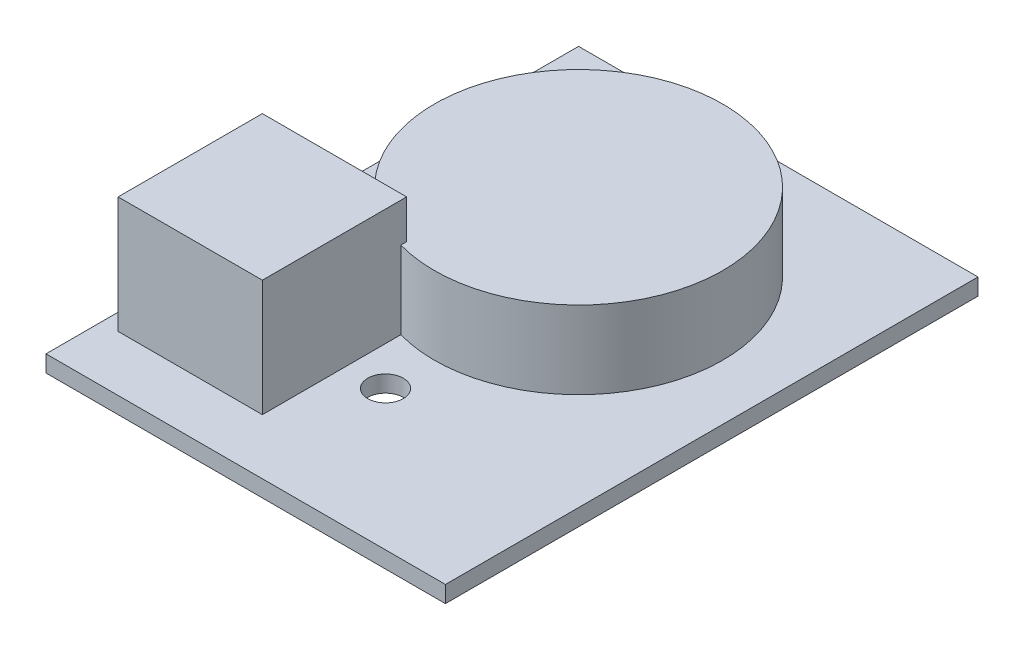
ISO-10303-21;
HEADER;
FILE_DESCRIPTION(('STEP AP214'),'2;1');
FILE_NAME('part.step','',(''),(''),'','','');
FILE_SCHEMA(('AUTOMOTIVE_DESIGN { 1 0 10303 214 1 1 1 1 }'));
ENDSEC;
DATA;
#1=APPLICATION_CONTEXT('core data for automotive mechanical design processes');
#2=APPLICATION_PROTOCOL_DEFINITION('international standard','automotive_design',2000,#1);
#3=PRODUCT_CONTEXT('',#1,'mechanical');
#4=PRODUCT('Part','Part','',(#3));
#5=PRODUCT_RELATED_PRODUCT_CATEGORY('part','',(#4));
#6=PRODUCT_DEFINITION_FORMATION('','',#4);
#7=PRODUCT_DEFINITION_CONTEXT('part definition',#1,'design');
#8=PRODUCT_DEFINITION('design','',#6,#7);
#9=PRODUCT_DEFINITION_SHAPE('','',#8);
#10=(LENGTH_UNIT() NAMED_UNIT(*) SI_UNIT(.MILLI.,.METRE.));
#11=(NAMED_UNIT(*) PLANE_ANGLE_UNIT() SI_UNIT($,.RADIAN.));
#12=(NAMED_UNIT(*) SI_UNIT($,.STERADIAN.) SOLID_ANGLE_UNIT());
#13=UNCERTAINTY_MEASURE_WITH_UNIT(LENGTH_MEASURE(1.E-05),#10,'distance_accuracy_value','');
#14=(GEOMETRIC_REPRESENTATION_CONTEXT(3) GLOBAL_UNCERTAINTY_ASSIGNED_CONTEXT((#13)) GLOBAL_UNIT_ASSIGNED_CONTEXT((#10,
#11,#12)) REPRESENTATION_CONTEXT('',''));
#15=CARTESIAN_POINT('',(0.,0.,0.));
#16=DIRECTION('',(0.,0.,1.));
#17=DIRECTION('',(1.,0.,0.));
#18=AXIS2_PLACEMENT_3D('',#15,#16,#17);
#19=CARTESIAN_POINT('',(-18.,1.5,24.));
#20=DIRECTION('',(-1.,0.,0.));
#21=DIRECTION('',(0.,0.,1.));
#22=AXIS2_PLACEMENT_3D('',#19,#20,#21);
#23=PLANE('',#22);
#24=DIRECTION('',(0.,0.,-1.));
#25=VECTOR('',#24,1.);
#26=CARTESIAN_POINT('',(-18.,0.,24.));
#27=LINE('',#26,#25);
#28=CARTESIAN_POINT('',(-18.,0.,24.));
#29=VERTEX_POINT('',#28);
#30=CARTESIAN_POINT('',(-18.,0.,-24.));
#31=VERTEX_POINT('',#30);
#32=EDGE_CURVE('E159',#29,#31,#27,.T.);
#33=ORIENTED_EDGE('',*,*,#32,.F.);
#34=DIRECTION('',(0.,-1.,0.));
#35=VECTOR('',#34,1.);
#36=CARTESIAN_POINT('',(-18.,1.5,24.));
#37=LINE('',#36,#35);
#38=CARTESIAN_POINT('',(-18.,1.5,24.));
#39=VERTEX_POINT('',#38);
#40=EDGE_CURVE('E163',#39,#29,#37,.T.);
#41=ORIENTED_EDGE('',*,*,#40,.F.);
#42=DIRECTION('',(0.,0.,-1.));
#43=VECTOR('',#42,1.);
#44=CARTESIAN_POINT('',(-18.,1.5,24.));
#45=LINE('',#44,#43);
#46=CARTESIAN_POINT('',(-18.,1.5,-24.));
#47=VERTEX_POINT('',#46);
#48=EDGE_CURVE('E164',#39,#47,#45,.T.);
#49=ORIENTED_EDGE('',*,*,#48,.T.);
#50=DIRECTION('',(0.,-1.,0.));
#51=VECTOR('',#50,1.);
#52=CARTESIAN_POINT('',(-18.,1.5,-24.));
#53=LINE('',#52,#51);
#54=EDGE_CURVE('E175',#47,#31,#53,.T.);
#55=ORIENTED_EDGE('',*,*,#54,.T.);
#56=EDGE_LOOP('',(#33,#41,#49,#55));
#57=FACE_BOUND('',#56,.T.);
#58=ADVANCED_FACE('F33',(#57),#23,.T.);
#59=CARTESIAN_POINT('',(-18.,1.5,24.));
#60=DIRECTION('',(0.,0.,-1.));
#61=DIRECTION('',(-1.,0.,0.));
#62=AXIS2_PLACEMENT_3D('',#59,#60,#61);
#63=PLANE('',#62);
#64=DIRECTION('',(1.,0.,0.));
#65=VECTOR('',#64,1.);
#66=CARTESIAN_POINT('',(-18.,0.,24.));
#67=LINE('',#66,#65);
#68=CARTESIAN_POINT('',(18.,0.,24.));
#69=VERTEX_POINT('',#68);
#70=EDGE_CURVE('E168',#29,#69,#67,.T.);
#71=ORIENTED_EDGE('',*,*,#70,.T.);
#72=DIRECTION('',(0.,-1.,0.));
#73=VECTOR('',#72,1.);
#74=CARTESIAN_POINT('',(18.,1.5,24.));
#75=LINE('',#74,#73);
#76=CARTESIAN_POINT('',(18.,1.5,24.));
#77=VERTEX_POINT('',#76);
#78=EDGE_CURVE('E186',#77,#69,#75,.T.);
#79=ORIENTED_EDGE('',*,*,#78,.F.);
#80=DIRECTION('',(1.,0.,0.));
#81=VECTOR('',#80,1.);
#82=CARTESIAN_POINT('',(-18.,1.5,24.));
#83=LINE('',#82,#81);
#84=EDGE_CURVE('E173',#39,#77,#83,.T.);
#85=ORIENTED_EDGE('',*,*,#84,.F.);
#86=ORIENTED_EDGE('',*,*,#40,.T.);
#87=EDGE_LOOP('',(#71,#79,#85,#86));
#88=FACE_BOUND('',#87,.T.);
#89=ADVANCED_FACE('F205',(#88),#63,.F.);
#90=CARTESIAN_POINT('',(18.,1.5,24.));
#91=DIRECTION('',(-1.,0.,0.));
#92=DIRECTION('',(0.,0.,1.));
#93=AXIS2_PLACEMENT_3D('',#90,#91,#92);
#94=PLANE('',#93);
#95=DIRECTION('',(0.,0.,-1.));
#96=VECTOR('',#95,1.);
#97=CARTESIAN_POINT('',(18.,0.,24.));
#98=LINE('',#97,#96);
#99=CARTESIAN_POINT('',(18.,0.,-24.));
#100=VERTEX_POINT('',#99);
#101=EDGE_CURVE('E181',#69,#100,#98,.T.);
#102=ORIENTED_EDGE('',*,*,#101,.T.);
#103=DIRECTION('',(0.,-1.,0.));
#104=VECTOR('',#103,1.);
#105=CARTESIAN_POINT('',(18.,1.5,-24.));
#106=LINE('',#105,#104);
#107=CARTESIAN_POINT('',(18.,1.5,-24.));
#108=VERTEX_POINT('',#107);
#109=EDGE_CURVE('E189',#108,#100,#106,.T.);
#110=ORIENTED_EDGE('',*,*,#109,.F.);
#111=DIRECTION('',(0.,0.,-1.));
#112=VECTOR('',#111,1.);
#113=CARTESIAN_POINT('',(18.,1.5,24.));
#114=LINE('',#113,#112);
#115=EDGE_CURVE('E171',#77,#108,#114,.T.);
#116=ORIENTED_EDGE('',*,*,#115,.F.);
#117=ORIENTED_EDGE('',*,*,#78,.T.);
#118=EDGE_LOOP('',(#102,#110,#116,#117));
#119=FACE_BOUND('',#118,.T.);
#120=ADVANCED_FACE('F209',(#119),#94,.F.);
#121=CARTESIAN_POINT('',(-18.,1.5,-24.));
#122=DIRECTION('',(0.,0.,-1.));
#123=DIRECTION('',(-1.,0.,0.));
#124=AXIS2_PLACEMENT_3D('',#121,#122,#123);
#125=PLANE('',#124);
#126=DIRECTION('',(1.,0.,0.));
#127=VECTOR('',#126,1.);
#128=CARTESIAN_POINT('',(-18.,0.,-24.));
#129=LINE('',#128,#127);
#130=EDGE_CURVE('E178',#31,#100,#129,.T.);
#131=ORIENTED_EDGE('',*,*,#130,.F.);
#132=ORIENTED_EDGE('',*,*,#54,.F.);
#133=DIRECTION('',(1.,0.,0.));
#134=VECTOR('',#133,1.);
#135=CARTESIAN_POINT('',(-18.,1.5,-24.));
#136=LINE('',#135,#134);
#137=EDGE_CURVE('E167',#47,#108,#136,.T.);
#138=ORIENTED_EDGE('',*,*,#137,.T.);
#139=ORIENTED_EDGE('',*,*,#109,.T.);
#140=EDGE_LOOP('',(#131,#132,#138,#139));
#141=FACE_BOUND('',#140,.T.);
#142=ADVANCED_FACE('F197',(#141),#125,.T.);
#143=CARTESIAN_POINT('',(0.,1.5,0.));
#144=DIRECTION('',(0.,-1.,0.));
#145=DIRECTION('',(0.,0.,-1.));
#146=AXIS2_PLACEMENT_3D('',#143,#144,#145);
#147=PLANE('',#146);
#148=CARTESIAN_POINT('',(0.,1.5,11.4));
#149=DIRECTION('',(0.,-1.,0.));
#150=DIRECTION('',(0.,0.,-1.));
#151=AXIS2_PLACEMENT_3D('',#148,#149,#150);
#152=CIRCLE('',#151,1.6);
#153=CARTESIAN_POINT('',(0.,1.5,9.8));
#154=VERTEX_POINT('',#153);
#155=EDGE_CURVE('E132',#154,#154,#152,.F.);
#156=ORIENTED_EDGE('',*,*,#155,.F.);
#157=EDGE_LOOP('',(#156));
#158=FACE_BOUND('',#157,.T.);
#159=DIRECTION('',(0.,0.,1.));
#160=VECTOR('',#159,1.);
#161=CARTESIAN_POINT('',(-16.5,1.5,0.));
#162=LINE('',#161,#160);
#163=CARTESIAN_POINT('',(-16.5,1.5,6.));
#164=VERTEX_POINT('',#163);
#165=CARTESIAN_POINT('',(-16.5,1.5,19.));
#166=VERTEX_POINT('',#165);
#167=EDGE_CURVE('E47',#164,#166,#162,.T.);
#168=ORIENTED_EDGE('',*,*,#167,.F.);
#169=DIRECTION('',(1.,0.,0.));
#170=VECTOR('',#169,1.);
#171=CARTESIAN_POINT('',(0.,1.5,6.));
#172=LINE('',#171,#170);
#173=CARTESIAN_POINT('',(-5.,1.5,6.));
#174=VERTEX_POINT('',#173);
#175=EDGE_CURVE('E152',#164,#174,#172,.T.);
#176=ORIENTED_EDGE('',*,*,#175,.T.);
#177=CARTESIAN_POINT('',(0.,1.5,-6.));
#178=DIRECTION('',(0.,-1.,0.));
#179=DIRECTION('',(0.,0.,-1.));
#180=AXIS2_PLACEMENT_3D('',#177,#178,#179);
#181=CIRCLE('',#180,13.);
#182=CARTESIAN_POINT('',(-3.5,1.5,6.51998402554891));
#183=VERTEX_POINT('',#182);
#184=EDGE_CURVE('E160',#183,#174,#181,.F.);
#185=ORIENTED_EDGE('',*,*,#184,.F.);
#186=DIRECTION('',(0.,0.,1.));
#187=VECTOR('',#186,1.);
#188=CARTESIAN_POINT('',(-3.5,1.5,0.));
#189=LINE('',#188,#187);
#190=CARTESIAN_POINT('',(-3.5,1.5,19.));
#191=VERTEX_POINT('',#190);
#192=EDGE_CURVE('E148',#183,#191,#189,.T.);
#193=ORIENTED_EDGE('',*,*,#192,.T.);
#194=DIRECTION('',(1.,0.,0.));
#195=VECTOR('',#194,1.);
#196=CARTESIAN_POINT('',(0.,1.5,19.));
#197=LINE('',#196,#195);
#198=EDGE_CURVE('E52',#166,#191,#197,.T.);
#199=ORIENTED_EDGE('',*,*,#198,.F.);
#200=EDGE_LOOP('',(#168,#176,#185,#193,#199));
#201=FACE_BOUND('',#200,.T.);
#202=ORIENTED_EDGE('',*,*,#48,.F.);
#203=ORIENTED_EDGE('',*,*,#84,.T.);
#204=ORIENTED_EDGE('',*,*,#115,.T.);
#205=ORIENTED_EDGE('',*,*,#137,.F.);
#206=EDGE_LOOP('',(#202,#203,#204,#205));
#207=FACE_BOUND('',#206,.T.);
#208=ADVANCED_FACE('F211',(#158,#201,#207),#147,.F.);
#209=CARTESIAN_POINT('',(0.,0.,0.));
#210=DIRECTION('',(0.,-1.,0.));
#211=DIRECTION('',(0.,0.,-1.));
#212=AXIS2_PLACEMENT_3D('',#209,#210,#211);
#213=PLANE('',#212);
#214=CARTESIAN_POINT('',(0.,0.,11.4));
#215=DIRECTION('',(0.,1.,0.));
#216=DIRECTION('',(0.,0.,1.));
#217=AXIS2_PLACEMENT_3D('',#214,#215,#216);
#218=CIRCLE('',#217,1.6);
#219=CARTESIAN_POINT('',(0.,0.,13.));
#220=VERTEX_POINT('',#219);
#221=EDGE_CURVE('E135',#220,#220,#218,.T.);
#222=ORIENTED_EDGE('',*,*,#221,.T.);
#223=EDGE_LOOP('',(#222));
#224=FACE_BOUND('',#223,.T.);
#225=ORIENTED_EDGE('',*,*,#32,.T.);
#226=ORIENTED_EDGE('',*,*,#130,.T.);
#227=ORIENTED_EDGE('',*,*,#101,.F.);
#228=ORIENTED_EDGE('',*,*,#70,.F.);
#229=EDGE_LOOP('',(#225,#226,#227,#228));
#230=FACE_BOUND('',#229,.T.);
#231=ADVANCED_FACE('F202',(#224,#230),#213,.T.);
#232=CARTESIAN_POINT('',(0.,8.5,-6.));
#233=DIRECTION('',(0.,-1.,0.));
#234=DIRECTION('',(0.,0.,-1.));
#235=AXIS2_PLACEMENT_3D('',#232,#233,#234);
#236=CYLINDRICAL_SURFACE('',#235,13.);
#237=ORIENTED_EDGE('',*,*,#184,.T.);
#238=DIRECTION('',(0.,-1.,0.));
#239=VECTOR('',#238,1.);
#240=CARTESIAN_POINT('',(-5.,8.5,6.));
#241=LINE('',#240,#239);
#242=CARTESIAN_POINT('',(-5.,8.5,6.));
#243=VERTEX_POINT('',#242);
#244=EDGE_CURVE('E150',#174,#243,#241,.F.);
#245=ORIENTED_EDGE('',*,*,#244,.T.);
#246=CARTESIAN_POINT('',(0.,8.5,-6.));
#247=DIRECTION('',(0.,1.,0.));
#248=DIRECTION('',(0.,0.,1.));
#249=AXIS2_PLACEMENT_3D('',#246,#247,#248);
#250=CIRCLE('',#249,13.);
#251=CARTESIAN_POINT('',(-3.5,8.5,6.51998402554891));
#252=VERTEX_POINT('',#251);
#253=EDGE_CURVE('E156',#252,#243,#250,.T.);
#254=ORIENTED_EDGE('',*,*,#253,.F.);
#255=DIRECTION('',(0.,-1.,0.));
#256=VECTOR('',#255,1.);
#257=CARTESIAN_POINT('',(-3.5,8.5,6.51998402554891));
#258=LINE('',#257,#256);
#259=EDGE_CURVE('E142',#252,#183,#258,.T.);
#260=ORIENTED_EDGE('',*,*,#259,.T.);
#261=EDGE_LOOP('',(#237,#245,#254,#260));
#262=FACE_BOUND('',#261,.T.);
#263=ADVANCED_FACE('F219',(#262),#236,.T.);
#264=CARTESIAN_POINT('',(0.,8.5,-6.));
#265=DIRECTION('',(0.,1.,0.));
#266=DIRECTION('',(0.,0.,1.));
#267=AXIS2_PLACEMENT_3D('',#264,#265,#266);
#268=PLANE('',#267);
#269=DIRECTION('',(-1.,0.,0.));
#270=VECTOR('',#269,1.);
#271=CARTESIAN_POINT('',(0.,8.5,6.));
#272=LINE('',#271,#270);
#273=CARTESIAN_POINT('',(-3.5,8.5,6.));
#274=VERTEX_POINT('',#273);
#275=EDGE_CURVE('E11',#274,#243,#272,.T.);
#276=ORIENTED_EDGE('',*,*,#275,.F.);
#277=DIRECTION('',(0.,0.,-1.));
#278=VECTOR('',#277,1.);
#279=CARTESIAN_POINT('',(-3.5,8.5,-6.));
#280=LINE('',#279,#278);
#281=EDGE_CURVE('E40',#252,#274,#280,.T.);
#282=ORIENTED_EDGE('',*,*,#281,.F.);
#283=ORIENTED_EDGE('',*,*,#253,.T.);
#284=EDGE_LOOP('',(#276,#282,#283));
#285=FACE_BOUND('',#284,.T.);
#286=ADVANCED_FACE('F249',(#285),#268,.T.);
#287=CARTESIAN_POINT('',(-16.5,12.,6.));
#288=DIRECTION('',(1.,0.,0.));
#289=DIRECTION('',(0.,0.,-1.));
#290=AXIS2_PLACEMENT_3D('',#287,#288,#289);
#291=PLANE('',#290);
#292=DIRECTION('',(0.,-1.,0.));
#293=VECTOR('',#292,1.);
#294=CARTESIAN_POINT('',(-16.5,12.,6.));
#295=LINE('',#294,#293);
#296=CARTESIAN_POINT('',(-16.5,12.,6.));
#297=VERTEX_POINT('',#296);
#298=EDGE_CURVE('E130',#297,#164,#295,.T.);
#299=ORIENTED_EDGE('',*,*,#298,.T.);
#300=ORIENTED_EDGE('',*,*,#167,.T.);
#301=DIRECTION('',(0.,-1.,0.));
#302=VECTOR('',#301,1.);
#303=CARTESIAN_POINT('',(-16.5,12.,19.));
#304=LINE('',#303,#302);
#305=CARTESIAN_POINT('',(-16.5,12.,19.));
#306=VERTEX_POINT('',#305);
#307=EDGE_CURVE('E143',#306,#166,#304,.T.);
#308=ORIENTED_EDGE('',*,*,#307,.F.);
#309=DIRECTION('',(0.,0.,1.));
#310=VECTOR('',#309,1.);
#311=CARTESIAN_POINT('',(-16.5,12.,6.));
#312=LINE('',#311,#310);
#313=EDGE_CURVE('E118',#297,#306,#312,.T.);
#314=ORIENTED_EDGE('',*,*,#313,.F.);
#315=EDGE_LOOP('',(#299,#300,#308,#314));
#316=FACE_BOUND('',#315,.T.);
#317=ADVANCED_FACE('F259',(#316),#291,.F.);
#318=CARTESIAN_POINT('',(-16.5,12.,19.));
#319=DIRECTION('',(0.,0.,-1.));
#320=DIRECTION('',(-1.,0.,0.));
#321=AXIS2_PLACEMENT_3D('',#318,#319,#320);
#322=PLANE('',#321);
#323=ORIENTED_EDGE('',*,*,#307,.T.);
#324=ORIENTED_EDGE('',*,*,#198,.T.);
#325=DIRECTION('',(0.,-1.,0.));
#326=VECTOR('',#325,1.);
#327=CARTESIAN_POINT('',(-3.5,12.,19.));
#328=LINE('',#327,#326);
#329=CARTESIAN_POINT('',(-3.5,12.,19.));
#330=VERTEX_POINT('',#329);
#331=EDGE_CURVE('E117',#330,#191,#328,.T.);
#332=ORIENTED_EDGE('',*,*,#331,.F.);
#333=DIRECTION('',(1.,0.,0.));
#334=VECTOR('',#333,1.);
#335=CARTESIAN_POINT('',(-16.5,12.,19.));
#336=LINE('',#335,#334);
#337=EDGE_CURVE('E125',#306,#330,#336,.T.);
#338=ORIENTED_EDGE('',*,*,#337,.F.);
#339=EDGE_LOOP('',(#323,#324,#332,#338));
#340=FACE_BOUND('',#339,.T.);
#341=ADVANCED_FACE('F269',(#340),#322,.F.);
#342=CARTESIAN_POINT('',(-16.5,12.,6.));
#343=DIRECTION('',(0.,0.,-1.));
#344=DIRECTION('',(-1.,0.,0.));
#345=AXIS2_PLACEMENT_3D('',#342,#343,#344);
#346=PLANE('',#345);
#347=ORIENTED_EDGE('',*,*,#175,.F.);
#348=ORIENTED_EDGE('',*,*,#298,.F.);
#349=DIRECTION('',(1.,0.,0.));
#350=VECTOR('',#349,1.);
#351=CARTESIAN_POINT('',(-16.5,12.,6.));
#352=LINE('',#351,#350);
#353=CARTESIAN_POINT('',(-3.5,12.,6.));
#354=VERTEX_POINT('',#353);
#355=EDGE_CURVE('E123',#297,#354,#352,.T.);
#356=ORIENTED_EDGE('',*,*,#355,.T.);
#357=DIRECTION('',(0.,-1.,0.));
#358=VECTOR('',#357,1.);
#359=CARTESIAN_POINT('',(-3.5,12.,6.));
#360=LINE('',#359,#358);
#361=EDGE_CURVE('E108',#354,#274,#360,.T.);
#362=ORIENTED_EDGE('',*,*,#361,.T.);
#363=ORIENTED_EDGE('',*,*,#275,.T.);
#364=ORIENTED_EDGE('',*,*,#244,.F.);
#365=EDGE_LOOP('',(#347,#348,#356,#362,#363,#364));
#366=FACE_BOUND('',#365,.T.);
#367=ADVANCED_FACE('F128',(#366),#346,.T.);
#368=CARTESIAN_POINT('',(-3.5,12.,6.));
#369=DIRECTION('',(1.,0.,0.));
#370=DIRECTION('',(0.,0.,-1.));
#371=AXIS2_PLACEMENT_3D('',#368,#369,#370);
#372=PLANE('',#371);
#373=ORIENTED_EDGE('',*,*,#192,.F.);
#374=ORIENTED_EDGE('',*,*,#259,.F.);
#375=ORIENTED_EDGE('',*,*,#281,.T.);
#376=ORIENTED_EDGE('',*,*,#361,.F.);
#377=DIRECTION('',(0.,0.,1.));
#378=VECTOR('',#377,1.);
#379=CARTESIAN_POINT('',(-3.5,12.,6.));
#380=LINE('',#379,#378);
#381=EDGE_CURVE('E113',#354,#330,#380,.T.);
#382=ORIENTED_EDGE('',*,*,#381,.T.);
#383=ORIENTED_EDGE('',*,*,#331,.T.);
#384=EDGE_LOOP('',(#373,#374,#375,#376,#382,#383));
#385=FACE_BOUND('',#384,.T.);
#386=ADVANCED_FACE('F111',(#385),#372,.T.);
#387=CARTESIAN_POINT('',(0.,12.,0.));
#388=DIRECTION('',(0.,-1.,0.));
#389=DIRECTION('',(0.,0.,-1.));
#390=AXIS2_PLACEMENT_3D('',#387,#388,#389);
#391=PLANE('',#390);
#392=ORIENTED_EDGE('',*,*,#355,.F.);
#393=ORIENTED_EDGE('',*,*,#313,.T.);
#394=ORIENTED_EDGE('',*,*,#337,.T.);
#395=ORIENTED_EDGE('',*,*,#381,.F.);
#396=EDGE_LOOP('',(#392,#393,#394,#395));
#397=FACE_BOUND('',#396,.T.);
#398=ADVANCED_FACE('F122',(#397),#391,.F.);
#399=CARTESIAN_POINT('',(0.,12.,11.4));
#400=DIRECTION('',(0.,-1.,0.));
#401=DIRECTION('',(0.,0.,-1.));
#402=AXIS2_PLACEMENT_3D('',#399,#400,#401);
#403=CYLINDRICAL_SURFACE('',#402,1.6);
#404=ORIENTED_EDGE('',*,*,#221,.F.);
#405=EDGE_LOOP('',(#404));
#406=FACE_BOUND('',#405,.T.);
#407=ORIENTED_EDGE('',*,*,#155,.T.);
#408=EDGE_LOOP('',(#407));
#409=FACE_BOUND('',#408,.T.);
#410=ADVANCED_FACE('F303',(#406,#409),#403,.F.);
#411=CLOSED_SHELL('',(#58,#89,#120,#142,#208,#231,#263,#286,#317,#341,#367,#386,#398,#410));
#412=MANIFOLD_SOLID_BREP('B2',#411);
#413=ADVANCED_BREP_SHAPE_REPRESENTATION('',(#18,#412),#14);
#414=SHAPE_DEFINITION_REPRESENTATION(#9,#413);
ENDSEC;
END-ISO-10303-21;
